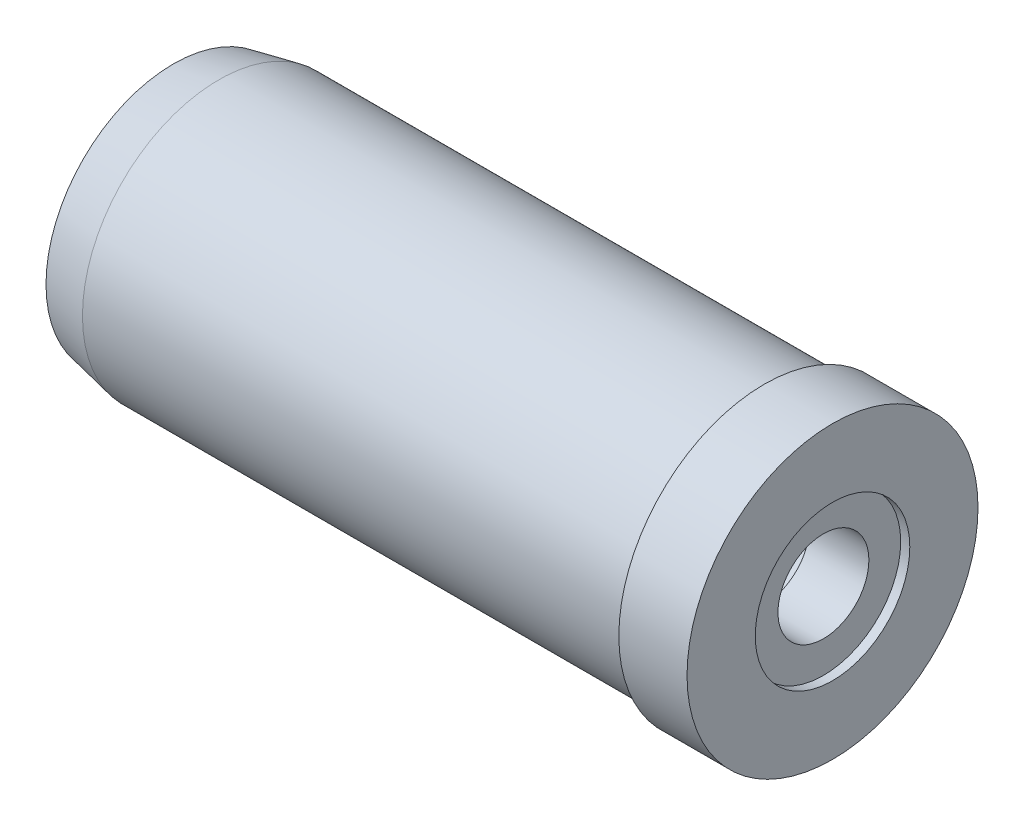
ISO-10303-21;
HEADER;
FILE_DESCRIPTION(('STEP AP214'),'2;1');
FILE_NAME('part.step','',(''),(''),'','','');
FILE_SCHEMA(('AUTOMOTIVE_DESIGN { 1 0 10303 214 1 1 1 1 }'));
ENDSEC;
DATA;
#1=APPLICATION_CONTEXT('core data for automotive mechanical design processes');
#2=APPLICATION_PROTOCOL_DEFINITION('international standard','automotive_design',2000,#1);
#3=PRODUCT_CONTEXT('',#1,'mechanical');
#4=PRODUCT('Part','Part','',(#3));
#5=PRODUCT_RELATED_PRODUCT_CATEGORY('part','',(#4));
#6=PRODUCT_DEFINITION_FORMATION('','',#4);
#7=PRODUCT_DEFINITION_CONTEXT('part definition',#1,'design');
#8=PRODUCT_DEFINITION('design','',#6,#7);
#9=PRODUCT_DEFINITION_SHAPE('','',#8);
#10=(LENGTH_UNIT() NAMED_UNIT(*) SI_UNIT(.MILLI.,.METRE.));
#11=(NAMED_UNIT(*) PLANE_ANGLE_UNIT() SI_UNIT($,.RADIAN.));
#12=(NAMED_UNIT(*) SI_UNIT($,.STERADIAN.) SOLID_ANGLE_UNIT());
#13=UNCERTAINTY_MEASURE_WITH_UNIT(LENGTH_MEASURE(1.E-05),#10,'distance_accuracy_value','');
#14=(GEOMETRIC_REPRESENTATION_CONTEXT(3) GLOBAL_UNCERTAINTY_ASSIGNED_CONTEXT((#13)) GLOBAL_UNIT_ASSIGNED_CONTEXT((#10,
#11,#12)) REPRESENTATION_CONTEXT('',''));
#15=CARTESIAN_POINT('',(0.,0.,0.));
#16=DIRECTION('',(0.,0.,1.));
#17=DIRECTION('',(1.,0.,0.));
#18=AXIS2_PLACEMENT_3D('',#15,#16,#17);
#19=CARTESIAN_POINT('',(32.5497741698933,0.,0.));
#20=DIRECTION('',(1.,0.,0.));
#21=DIRECTION('',(0.,0.,-1.));
#22=AXIS2_PLACEMENT_3D('',#19,#20,#21);
#23=CYLINDRICAL_SURFACE('',#22,10.);
#24=CARTESIAN_POINT('',(175.54977417,0.,0.));
#25=DIRECTION('',(1.,0.,0.));
#26=DIRECTION('',(0.,0.,-1.));
#27=AXIS2_PLACEMENT_3D('',#24,#25,#26);
#28=CIRCLE('',#27,10.);
#29=CARTESIAN_POINT('',(175.54977417,0.,-10.));
#30=VERTEX_POINT('',#29);
#31=EDGE_CURVE('E10',#30,#30,#28,.T.);
#32=ORIENTED_EDGE('',*,*,#31,.T.);
#33=EDGE_LOOP('',(#32));
#34=FACE_BOUND('',#33,.T.);
#35=CARTESIAN_POINT('',(162.54977417,0.,0.));
#36=DIRECTION('',(1.,0.,0.));
#37=DIRECTION('',(0.,0.,-1.));
#38=AXIS2_PLACEMENT_3D('',#35,#36,#37);
#39=CIRCLE('',#38,10.);
#40=CARTESIAN_POINT('',(162.54977417,0.,-10.));
#41=VERTEX_POINT('',#40);
#42=EDGE_CURVE('E77',#41,#41,#39,.T.);
#43=ORIENTED_EDGE('',*,*,#42,.F.);
#44=EDGE_LOOP('',(#43));
#45=FACE_BOUND('',#44,.T.);
#46=ADVANCED_FACE('F40',(#34,#45),#23,.F.);
#47=CARTESIAN_POINT('',(175.54977417,10.,0.));
#48=DIRECTION('',(1.,0.,0.));
#49=DIRECTION('',(0.,0.,-1.));
#50=AXIS2_PLACEMENT_3D('',#47,#48,#49);
#51=PLANE('',#50);
#52=CARTESIAN_POINT('',(175.54977417,0.,0.));
#53=DIRECTION('',(1.,0.,0.));
#54=DIRECTION('',(0.,0.,-1.));
#55=AXIS2_PLACEMENT_3D('',#52,#53,#54);
#56=CIRCLE('',#55,17.);
#57=CARTESIAN_POINT('',(175.54977417,0.,-17.));
#58=VERTEX_POINT('',#57);
#59=EDGE_CURVE('E46',#58,#58,#56,.T.);
#60=ORIENTED_EDGE('',*,*,#59,.T.);
#61=EDGE_LOOP('',(#60));
#62=FACE_BOUND('',#61,.T.);
#63=ORIENTED_EDGE('',*,*,#31,.F.);
#64=EDGE_LOOP('',(#63));
#65=FACE_BOUND('',#64,.T.);
#66=ADVANCED_FACE('F85',(#62,#65),#51,.T.);
#67=CARTESIAN_POINT('',(32.5497741698933,0.,0.));
#68=DIRECTION('',(1.,0.,0.));
#69=DIRECTION('',(0.,0.,-1.));
#70=AXIS2_PLACEMENT_3D('',#67,#68,#69);
#71=CYLINDRICAL_SURFACE('',#70,17.);
#72=CARTESIAN_POINT('',(177.54977417,0.,0.));
#73=DIRECTION('',(1.,0.,0.));
#74=DIRECTION('',(0.,0.,-1.));
#75=AXIS2_PLACEMENT_3D('',#72,#73,#74);
#76=CIRCLE('',#75,17.);
#77=CARTESIAN_POINT('',(177.54977417,0.,-17.));
#78=VERTEX_POINT('',#77);
#79=EDGE_CURVE('E50',#78,#78,#76,.T.);
#80=ORIENTED_EDGE('',*,*,#79,.T.);
#81=EDGE_LOOP('',(#80));
#82=FACE_BOUND('',#81,.T.);
#83=ORIENTED_EDGE('',*,*,#59,.F.);
#84=EDGE_LOOP('',(#83));
#85=FACE_BOUND('',#84,.T.);
#86=ADVANCED_FACE('F89',(#82,#85),#71,.F.);
#87=CARTESIAN_POINT('',(177.54977417,17.,0.));
#88=DIRECTION('',(1.,0.,0.));
#89=DIRECTION('',(0.,0.,-1.));
#90=AXIS2_PLACEMENT_3D('',#87,#88,#89);
#91=PLANE('',#90);
#92=CARTESIAN_POINT('',(177.54977417,0.,0.));
#93=DIRECTION('',(1.,0.,0.));
#94=DIRECTION('',(0.,0.,-1.));
#95=AXIS2_PLACEMENT_3D('',#92,#93,#94);
#96=CIRCLE('',#95,32.);
#97=CARTESIAN_POINT('',(177.54977417,0.,-32.));
#98=VERTEX_POINT('',#97);
#99=EDGE_CURVE('E54',#98,#98,#96,.T.);
#100=ORIENTED_EDGE('',*,*,#99,.T.);
#101=EDGE_LOOP('',(#100));
#102=FACE_BOUND('',#101,.T.);
#103=ORIENTED_EDGE('',*,*,#79,.F.);
#104=EDGE_LOOP('',(#103));
#105=FACE_BOUND('',#104,.T.);
#106=ADVANCED_FACE('F93',(#102,#105),#91,.T.);
#107=CARTESIAN_POINT('',(32.5497741698933,0.,0.));
#108=DIRECTION('',(1.,0.,0.));
#109=DIRECTION('',(0.,0.,-1.));
#110=AXIS2_PLACEMENT_3D('',#107,#108,#109);
#111=CYLINDRICAL_SURFACE('',#110,32.);
#112=CARTESIAN_POINT('',(162.549774170007,0.,0.));
#113=DIRECTION('',(1.,0.,0.));
#114=DIRECTION('',(0.,0.,-1.));
#115=AXIS2_PLACEMENT_3D('',#112,#113,#114);
#116=CIRCLE('',#115,32.);
#117=CARTESIAN_POINT('',(162.549774170007,0.,-32.));
#118=VERTEX_POINT('',#117);
#119=EDGE_CURVE('E59',#118,#118,#116,.T.);
#120=ORIENTED_EDGE('',*,*,#119,.T.);
#121=EDGE_LOOP('',(#120));
#122=FACE_BOUND('',#121,.T.);
#123=ORIENTED_EDGE('',*,*,#99,.F.);
#124=EDGE_LOOP('',(#123));
#125=FACE_BOUND('',#124,.T.);
#126=ADVANCED_FACE('F100',(#122,#125),#111,.T.);
#127=CARTESIAN_POINT('',(162.549774170007,32.,0.));
#128=DIRECTION('',(-1.,0.,0.));
#129=DIRECTION('',(0.,0.,1.));
#130=AXIS2_PLACEMENT_3D('',#127,#128,#129);
#131=PLANE('',#130);
#132=CARTESIAN_POINT('',(162.549774170007,0.,0.));
#133=DIRECTION('',(1.,0.,0.));
#134=DIRECTION('',(0.,0.,-1.));
#135=AXIS2_PLACEMENT_3D('',#132,#133,#134);
#136=CIRCLE('',#135,30.);
#137=CARTESIAN_POINT('',(162.549774170007,0.,-30.));
#138=VERTEX_POINT('',#137);
#139=EDGE_CURVE('E62',#138,#138,#136,.T.);
#140=ORIENTED_EDGE('',*,*,#139,.T.);
#141=EDGE_LOOP('',(#140));
#142=FACE_BOUND('',#141,.T.);
#143=ORIENTED_EDGE('',*,*,#119,.F.);
#144=EDGE_LOOP('',(#143));
#145=FACE_BOUND('',#144,.T.);
#146=ADVANCED_FACE('F104',(#142,#145),#131,.T.);
#147=CARTESIAN_POINT('',(32.5497741698933,0.,0.));
#148=DIRECTION('',(1.,0.,0.));
#149=DIRECTION('',(0.,0.,-1.));
#150=AXIS2_PLACEMENT_3D('',#147,#148,#149);
#151=CYLINDRICAL_SURFACE('',#150,30.);
#152=CARTESIAN_POINT('',(42.5664419942067,0.,0.));
#153=DIRECTION('',(1.,0.,0.));
#154=DIRECTION('',(0.,0.,-1.));
#155=AXIS2_PLACEMENT_3D('',#152,#153,#154);
#156=CIRCLE('',#155,30.);
#157=CARTESIAN_POINT('',(42.5664419942067,0.,-30.));
#158=VERTEX_POINT('',#157);
#159=EDGE_CURVE('E65',#158,#158,#156,.T.);
#160=ORIENTED_EDGE('',*,*,#159,.T.);
#161=EDGE_LOOP('',(#160));
#162=FACE_BOUND('',#161,.T.);
#163=ORIENTED_EDGE('',*,*,#139,.F.);
#164=EDGE_LOOP('',(#163));
#165=FACE_BOUND('',#164,.T.);
#166=ADVANCED_FACE('F108',(#162,#165),#151,.T.);
#167=CARTESIAN_POINT('',(42.5664419942067,0.,0.));
#168=DIRECTION('',(1.,0.,0.));
#169=DIRECTION('',(0.,0.,-1.));
#170=AXIS2_PLACEMENT_3D('',#167,#168,#169);
#171=CONICAL_SURFACE('',#170,30.,0.197075537669811);
#172=CARTESIAN_POINT('',(32.5497741699,0.,0.));
#173=DIRECTION('',(1.,0.,0.));
#174=DIRECTION('',(0.,0.,-1.));
#175=AXIS2_PLACEMENT_3D('',#172,#173,#174);
#176=CIRCLE('',#175,27.9999999999987);
#177=CARTESIAN_POINT('',(32.5497741699,0.,-27.9999999999987));
#178=VERTEX_POINT('',#177);
#179=EDGE_CURVE('E68',#178,#178,#176,.T.);
#180=ORIENTED_EDGE('',*,*,#179,.T.);
#181=EDGE_LOOP('',(#180));
#182=FACE_BOUND('',#181,.T.);
#183=ORIENTED_EDGE('',*,*,#159,.F.);
#184=EDGE_LOOP('',(#183));
#185=FACE_BOUND('',#184,.T.);
#186=ADVANCED_FACE('F112',(#182,#185),#171,.T.);
#187=CARTESIAN_POINT('',(32.5497741699,27.9999999999987,0.));
#188=DIRECTION('',(-1.,0.,0.));
#189=DIRECTION('',(0.,0.,1.));
#190=AXIS2_PLACEMENT_3D('',#187,#188,#189);
#191=PLANE('',#190);
#192=CARTESIAN_POINT('',(32.5497741699,0.,0.));
#193=DIRECTION('',(1.,0.,0.));
#194=DIRECTION('',(0.,0.,-1.));
#195=AXIS2_PLACEMENT_3D('',#192,#193,#194);
#196=CIRCLE('',#195,24.);
#197=CARTESIAN_POINT('',(32.5497741699,0.,-24.));
#198=VERTEX_POINT('',#197);
#199=EDGE_CURVE('E71',#198,#198,#196,.T.);
#200=ORIENTED_EDGE('',*,*,#199,.T.);
#201=EDGE_LOOP('',(#200));
#202=FACE_BOUND('',#201,.T.);
#203=ORIENTED_EDGE('',*,*,#179,.F.);
#204=EDGE_LOOP('',(#203));
#205=FACE_BOUND('',#204,.T.);
#206=ADVANCED_FACE('F116',(#202,#205),#191,.T.);
#207=CARTESIAN_POINT('',(32.5497741698933,0.,0.));
#208=DIRECTION('',(1.,0.,0.));
#209=DIRECTION('',(0.,0.,-1.));
#210=AXIS2_PLACEMENT_3D('',#207,#208,#209);
#211=CYLINDRICAL_SURFACE('',#210,24.);
#212=CARTESIAN_POINT('',(162.54977417,0.,0.));
#213=DIRECTION('',(1.,0.,0.));
#214=DIRECTION('',(0.,0.,-1.));
#215=AXIS2_PLACEMENT_3D('',#212,#213,#214);
#216=CIRCLE('',#215,24.);
#217=CARTESIAN_POINT('',(162.54977417,0.,-24.));
#218=VERTEX_POINT('',#217);
#219=EDGE_CURVE('E74',#218,#218,#216,.T.);
#220=ORIENTED_EDGE('',*,*,#219,.T.);
#221=EDGE_LOOP('',(#220));
#222=FACE_BOUND('',#221,.T.);
#223=ORIENTED_EDGE('',*,*,#199,.F.);
#224=EDGE_LOOP('',(#223));
#225=FACE_BOUND('',#224,.T.);
#226=ADVANCED_FACE('F120',(#222,#225),#211,.F.);
#227=CARTESIAN_POINT('',(162.54977417,24.,0.));
#228=DIRECTION('',(-1.,0.,0.));
#229=DIRECTION('',(0.,0.,1.));
#230=AXIS2_PLACEMENT_3D('',#227,#228,#229);
#231=PLANE('',#230);
#232=ORIENTED_EDGE('',*,*,#42,.T.);
#233=EDGE_LOOP('',(#232));
#234=FACE_BOUND('',#233,.T.);
#235=ORIENTED_EDGE('',*,*,#219,.F.);
#236=EDGE_LOOP('',(#235));
#237=FACE_BOUND('',#236,.T.);
#238=ADVANCED_FACE('F81',(#234,#237),#231,.T.);
#239=CLOSED_SHELL('',(#46,#66,#86,#106,#126,#146,#166,#186,#206,#226,#238));
#240=MANIFOLD_SOLID_BREP('B2',#239);
#241=ADVANCED_BREP_SHAPE_REPRESENTATION('',(#18,#240),#14);
#242=SHAPE_DEFINITION_REPRESENTATION(#9,#241);
ENDSEC;
END-ISO-10303-21;
